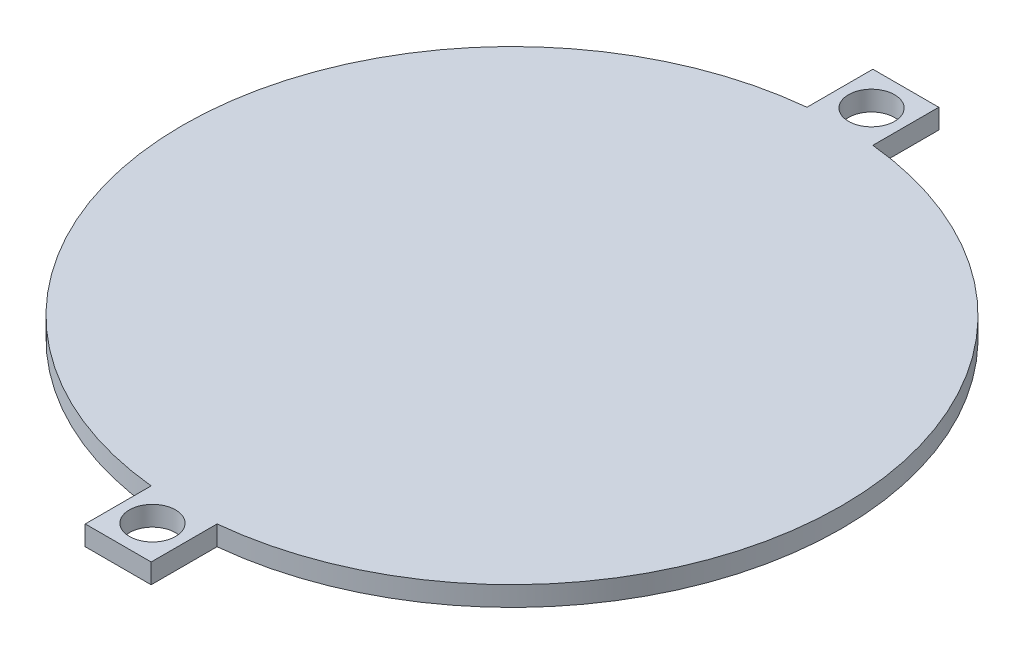
ISO-10303-21;
HEADER;
FILE_DESCRIPTION(('STEP AP214'),'2;1');
FILE_NAME('part.step','',(''),(''),'','','');
FILE_SCHEMA(('AUTOMOTIVE_DESIGN { 1 0 10303 214 1 1 1 1 }'));
ENDSEC;
DATA;
#1=APPLICATION_CONTEXT('core data for automotive mechanical design processes');
#2=APPLICATION_PROTOCOL_DEFINITION('international standard','automotive_design',2000,#1);
#3=PRODUCT_CONTEXT('',#1,'mechanical');
#4=PRODUCT('Part','Part','',(#3));
#5=PRODUCT_RELATED_PRODUCT_CATEGORY('part','',(#4));
#6=PRODUCT_DEFINITION_FORMATION('','',#4);
#7=PRODUCT_DEFINITION_CONTEXT('part definition',#1,'design');
#8=PRODUCT_DEFINITION('design','',#6,#7);
#9=PRODUCT_DEFINITION_SHAPE('','',#8);
#10=(LENGTH_UNIT() NAMED_UNIT(*) SI_UNIT(.MILLI.,.METRE.));
#11=(NAMED_UNIT(*) PLANE_ANGLE_UNIT() SI_UNIT($,.RADIAN.));
#12=(NAMED_UNIT(*) SI_UNIT($,.STERADIAN.) SOLID_ANGLE_UNIT());
#13=UNCERTAINTY_MEASURE_WITH_UNIT(LENGTH_MEASURE(1.E-05),#10,'distance_accuracy_value','');
#14=(GEOMETRIC_REPRESENTATION_CONTEXT(3) GLOBAL_UNCERTAINTY_ASSIGNED_CONTEXT((#13)) GLOBAL_UNIT_ASSIGNED_CONTEXT((#10,
#11,#12)) REPRESENTATION_CONTEXT('',''));
#15=CARTESIAN_POINT('',(0.,0.,0.));
#16=DIRECTION('',(0.,0.,1.));
#17=DIRECTION('',(1.,0.,0.));
#18=AXIS2_PLACEMENT_3D('',#15,#16,#17);
#19=CARTESIAN_POINT('',(0.,12.,0.));
#20=DIRECTION('',(0.,-1.,0.));
#21=DIRECTION('',(0.,0.,-1.));
#22=AXIS2_PLACEMENT_3D('',#19,#20,#21);
#23=CYLINDRICAL_SURFACE('',#22,50.);
#24=CARTESIAN_POINT('',(0.,3.,0.));
#25=DIRECTION('',(0.,1.,0.));
#26=DIRECTION('',(0.,0.,1.));
#27=AXIS2_PLACEMENT_3D('',#24,#25,#26);
#28=CIRCLE('',#27,50.);
#29=CARTESIAN_POINT('',(5.,3.,49.749371855331));
#30=VERTEX_POINT('',#29);
#31=CARTESIAN_POINT('',(5.,3.,-49.749371855331));
#32=VERTEX_POINT('',#31);
#33=EDGE_CURVE('E101',#30,#32,#28,.T.);
#34=ORIENTED_EDGE('',*,*,#33,.F.);
#35=DIRECTION('',(0.,-1.,0.));
#36=VECTOR('',#35,1.);
#37=CARTESIAN_POINT('',(5.,3.,49.749371855331));
#38=LINE('',#37,#36);
#39=CARTESIAN_POINT('',(5.,0.,49.749371855331));
#40=VERTEX_POINT('',#39);
#41=EDGE_CURVE('E103',#30,#40,#38,.T.);
#42=ORIENTED_EDGE('',*,*,#41,.T.);
#43=CARTESIAN_POINT('',(0.,0.,0.));
#44=DIRECTION('',(0.,1.,0.));
#45=DIRECTION('',(0.,0.,1.));
#46=AXIS2_PLACEMENT_3D('',#43,#44,#45);
#47=CIRCLE('',#46,50.);
#48=CARTESIAN_POINT('',(5.,0.,-49.749371855331));
#49=VERTEX_POINT('',#48);
#50=EDGE_CURVE('E44',#40,#49,#47,.T.);
#51=ORIENTED_EDGE('',*,*,#50,.T.);
#52=DIRECTION('',(0.,-1.,0.));
#53=VECTOR('',#52,1.);
#54=CARTESIAN_POINT('',(5.,3.,-49.749371855331));
#55=LINE('',#54,#53);
#56=EDGE_CURVE('E106',#32,#49,#55,.T.);
#57=ORIENTED_EDGE('',*,*,#56,.F.);
#58=EDGE_LOOP('',(#34,#42,#51,#57));
#59=FACE_BOUND('',#58,.T.);
#60=ADVANCED_FACE('F36',(#59),#23,.T.);
#61=CARTESIAN_POINT('',(-5.,3.,-49.749371855331));
#62=VERTEX_POINT('',#61);
#63=CARTESIAN_POINT('',(-5.,3.,49.749371855331));
#64=VERTEX_POINT('',#63);
#65=EDGE_CURVE('E52',#62,#64,#28,.T.);
#66=ORIENTED_EDGE('',*,*,#65,.F.);
#67=DIRECTION('',(0.,-1.,0.));
#68=VECTOR('',#67,1.);
#69=CARTESIAN_POINT('',(-5.,3.,-49.749371855331));
#70=LINE('',#69,#68);
#71=CARTESIAN_POINT('',(-5.,0.,-49.749371855331));
#72=VERTEX_POINT('',#71);
#73=EDGE_CURVE('E164',#62,#72,#70,.T.);
#74=ORIENTED_EDGE('',*,*,#73,.T.);
#75=CARTESIAN_POINT('',(-5.,0.,49.749371855331));
#76=VERTEX_POINT('',#75);
#77=EDGE_CURVE('E11',#72,#76,#47,.T.);
#78=ORIENTED_EDGE('',*,*,#77,.T.);
#79=DIRECTION('',(0.,-1.,0.));
#80=VECTOR('',#79,1.);
#81=CARTESIAN_POINT('',(-5.,3.,49.749371855331));
#82=LINE('',#81,#80);
#83=EDGE_CURVE('E117',#64,#76,#82,.T.);
#84=ORIENTED_EDGE('',*,*,#83,.F.);
#85=EDGE_LOOP('',(#66,#74,#78,#84));
#86=FACE_BOUND('',#85,.T.);
#87=ADVANCED_FACE('F187',(#86),#23,.T.);
#88=CARTESIAN_POINT('',(0.,0.,0.));
#89=DIRECTION('',(0.,1.,0.));
#90=DIRECTION('',(0.,0.,1.));
#91=AXIS2_PLACEMENT_3D('',#88,#89,#90);
#92=PLANE('',#91);
#93=CARTESIAN_POINT('',(0.,0.,-54.549371855331));
#94=DIRECTION('',(0.,-1.,0.));
#95=DIRECTION('',(0.,0.,-1.));
#96=AXIS2_PLACEMENT_3D('',#93,#94,#95);
#97=CIRCLE('',#96,3.5);
#98=CARTESIAN_POINT('',(0.,0.,-58.049371855331));
#99=VERTEX_POINT('',#98);
#100=EDGE_CURVE('E174',#99,#99,#97,.T.);
#101=ORIENTED_EDGE('',*,*,#100,.F.);
#102=EDGE_LOOP('',(#101));
#103=FACE_BOUND('',#102,.T.);
#104=CARTESIAN_POINT('',(0.,0.,54.549371855331));
#105=DIRECTION('',(0.,-1.,0.));
#106=DIRECTION('',(0.,0.,-1.));
#107=AXIS2_PLACEMENT_3D('',#104,#105,#106);
#108=CIRCLE('',#107,3.5);
#109=CARTESIAN_POINT('',(0.,0.,51.049371855331));
#110=VERTEX_POINT('',#109);
#111=EDGE_CURVE('E132',#110,#110,#108,.T.);
#112=ORIENTED_EDGE('',*,*,#111,.F.);
#113=EDGE_LOOP('',(#112));
#114=FACE_BOUND('',#113,.T.);
#115=ORIENTED_EDGE('',*,*,#50,.F.);
#116=DIRECTION('',(0.,0.,1.));
#117=VECTOR('',#116,1.);
#118=CARTESIAN_POINT('',(5.,0.,59.749371855331));
#119=LINE('',#118,#117);
#120=CARTESIAN_POINT('',(5.,0.,59.749371855331));
#121=VERTEX_POINT('',#120);
#122=EDGE_CURVE('E115',#40,#121,#119,.T.);
#123=ORIENTED_EDGE('',*,*,#122,.T.);
#124=DIRECTION('',(-1.,0.,0.));
#125=VECTOR('',#124,1.);
#126=CARTESIAN_POINT('',(5.,0.,59.749371855331));
#127=LINE('',#126,#125);
#128=CARTESIAN_POINT('',(-5.,0.,59.749371855331));
#129=VERTEX_POINT('',#128);
#130=EDGE_CURVE('E129',#121,#129,#127,.T.);
#131=ORIENTED_EDGE('',*,*,#130,.T.);
#132=DIRECTION('',(0.,0.,-1.));
#133=VECTOR('',#132,1.);
#134=CARTESIAN_POINT('',(-5.,0.,59.749371855331));
#135=LINE('',#134,#133);
#136=EDGE_CURVE('E124',#129,#76,#135,.T.);
#137=ORIENTED_EDGE('',*,*,#136,.T.);
#138=ORIENTED_EDGE('',*,*,#77,.F.);
#139=DIRECTION('',(0.,0.,-1.));
#140=VECTOR('',#139,1.);
#141=CARTESIAN_POINT('',(-5.,0.,-49.749371855331));
#142=LINE('',#141,#140);
#143=CARTESIAN_POINT('',(-5.,0.,-59.749371855331));
#144=VERTEX_POINT('',#143);
#145=EDGE_CURVE('E157',#72,#144,#142,.T.);
#146=ORIENTED_EDGE('',*,*,#145,.T.);
#147=DIRECTION('',(-1.,0.,0.));
#148=VECTOR('',#147,1.);
#149=CARTESIAN_POINT('',(5.,0.,-59.749371855331));
#150=LINE('',#149,#148);
#151=CARTESIAN_POINT('',(5.,0.,-59.749371855331));
#152=VERTEX_POINT('',#151);
#153=EDGE_CURVE('E116',#152,#144,#150,.T.);
#154=ORIENTED_EDGE('',*,*,#153,.F.);
#155=DIRECTION('',(0.,0.,-1.));
#156=VECTOR('',#155,1.);
#157=CARTESIAN_POINT('',(5.,0.,-49.749371855331));
#158=LINE('',#157,#156);
#159=EDGE_CURVE('E149',#49,#152,#158,.T.);
#160=ORIENTED_EDGE('',*,*,#159,.F.);
#161=EDGE_LOOP('',(#115,#123,#131,#137,#138,#146,#154,#160));
#162=FACE_BOUND('',#161,.T.);
#163=ADVANCED_FACE('F183',(#103,#114,#162),#92,.F.);
#164=CARTESIAN_POINT('',(5.,3.,-59.749371855331));
#165=DIRECTION('',(0.,0.,1.));
#166=DIRECTION('',(1.,0.,0.));
#167=AXIS2_PLACEMENT_3D('',#164,#165,#166);
#168=PLANE('',#167);
#169=ORIENTED_EDGE('',*,*,#153,.T.);
#170=DIRECTION('',(0.,-1.,0.));
#171=VECTOR('',#170,1.);
#172=CARTESIAN_POINT('',(-5.,3.,-59.749371855331));
#173=LINE('',#172,#171);
#174=CARTESIAN_POINT('',(-5.,3.,-59.749371855331));
#175=VERTEX_POINT('',#174);
#176=EDGE_CURVE('E166',#175,#144,#173,.T.);
#177=ORIENTED_EDGE('',*,*,#176,.F.);
#178=DIRECTION('',(-1.,0.,0.));
#179=VECTOR('',#178,1.);
#180=CARTESIAN_POINT('',(5.,3.,-59.749371855331));
#181=LINE('',#180,#179);
#182=CARTESIAN_POINT('',(5.,3.,-59.749371855331));
#183=VERTEX_POINT('',#182);
#184=EDGE_CURVE('E146',#183,#175,#181,.T.);
#185=ORIENTED_EDGE('',*,*,#184,.F.);
#186=DIRECTION('',(0.,-1.,0.));
#187=VECTOR('',#186,1.);
#188=CARTESIAN_POINT('',(5.,3.,-59.749371855331));
#189=LINE('',#188,#187);
#190=EDGE_CURVE('E154',#183,#152,#189,.T.);
#191=ORIENTED_EDGE('',*,*,#190,.T.);
#192=EDGE_LOOP('',(#169,#177,#185,#191));
#193=FACE_BOUND('',#192,.T.);
#194=ADVANCED_FACE('F186',(#193),#168,.F.);
#195=CARTESIAN_POINT('',(-5.,3.,-49.749371855331));
#196=DIRECTION('',(-1.,0.,0.));
#197=DIRECTION('',(0.,0.,1.));
#198=AXIS2_PLACEMENT_3D('',#195,#196,#197);
#199=PLANE('',#198);
#200=ORIENTED_EDGE('',*,*,#145,.F.);
#201=ORIENTED_EDGE('',*,*,#73,.F.);
#202=DIRECTION('',(0.,0.,-1.));
#203=VECTOR('',#202,1.);
#204=CARTESIAN_POINT('',(-5.,3.,-49.749371855331));
#205=LINE('',#204,#203);
#206=EDGE_CURVE('E148',#62,#175,#205,.T.);
#207=ORIENTED_EDGE('',*,*,#206,.T.);
#208=ORIENTED_EDGE('',*,*,#176,.T.);
#209=EDGE_LOOP('',(#200,#201,#207,#208));
#210=FACE_BOUND('',#209,.T.);
#211=ADVANCED_FACE('F200',(#210),#199,.T.);
#212=CARTESIAN_POINT('',(5.,3.,-49.749371855331));
#213=DIRECTION('',(-1.,0.,0.));
#214=DIRECTION('',(0.,0.,1.));
#215=AXIS2_PLACEMENT_3D('',#212,#213,#214);
#216=PLANE('',#215);
#217=ORIENTED_EDGE('',*,*,#159,.T.);
#218=ORIENTED_EDGE('',*,*,#190,.F.);
#219=DIRECTION('',(0.,0.,-1.));
#220=VECTOR('',#219,1.);
#221=CARTESIAN_POINT('',(5.,3.,-49.749371855331));
#222=LINE('',#221,#220);
#223=EDGE_CURVE('E152',#32,#183,#222,.T.);
#224=ORIENTED_EDGE('',*,*,#223,.F.);
#225=ORIENTED_EDGE('',*,*,#56,.T.);
#226=EDGE_LOOP('',(#217,#218,#224,#225));
#227=FACE_BOUND('',#226,.T.);
#228=ADVANCED_FACE('F192',(#227),#216,.F.);
#229=CARTESIAN_POINT('',(0.,3.,0.));
#230=DIRECTION('',(0.,-1.,0.));
#231=DIRECTION('',(0.,0.,-1.));
#232=AXIS2_PLACEMENT_3D('',#229,#230,#231);
#233=PLANE('',#232);
#234=CARTESIAN_POINT('',(0.,3.,-54.549371855331));
#235=DIRECTION('',(0.,-1.,0.));
#236=DIRECTION('',(0.,0.,-1.));
#237=AXIS2_PLACEMENT_3D('',#234,#235,#236);
#238=CIRCLE('',#237,3.5);
#239=CARTESIAN_POINT('',(0.,3.,-58.049371855331));
#240=VERTEX_POINT('',#239);
#241=EDGE_CURVE('E39',#240,#240,#238,.T.);
#242=ORIENTED_EDGE('',*,*,#241,.T.);
#243=EDGE_LOOP('',(#242));
#244=FACE_BOUND('',#243,.T.);
#245=ORIENTED_EDGE('',*,*,#206,.F.);
#246=ORIENTED_EDGE('',*,*,#65,.T.);
#247=DIRECTION('',(0.,0.,-1.));
#248=VECTOR('',#247,1.);
#249=CARTESIAN_POINT('',(-5.,3.,59.749371855331));
#250=LINE('',#249,#248);
#251=CARTESIAN_POINT('',(-5.,3.,59.749371855331));
#252=VERTEX_POINT('',#251);
#253=EDGE_CURVE('E126',#252,#64,#250,.T.);
#254=ORIENTED_EDGE('',*,*,#253,.F.);
#255=DIRECTION('',(-1.,0.,0.));
#256=VECTOR('',#255,1.);
#257=CARTESIAN_POINT('',(5.,3.,59.749371855331));
#258=LINE('',#257,#256);
#259=CARTESIAN_POINT('',(5.,3.,59.749371855331));
#260=VERTEX_POINT('',#259);
#261=EDGE_CURVE('E123',#260,#252,#258,.T.);
#262=ORIENTED_EDGE('',*,*,#261,.F.);
#263=DIRECTION('',(0.,0.,1.));
#264=VECTOR('',#263,1.);
#265=CARTESIAN_POINT('',(5.,3.,59.749371855331));
#266=LINE('',#265,#264);
#267=EDGE_CURVE('E113',#30,#260,#266,.T.);
#268=ORIENTED_EDGE('',*,*,#267,.F.);
#269=ORIENTED_EDGE('',*,*,#33,.T.);
#270=ORIENTED_EDGE('',*,*,#223,.T.);
#271=ORIENTED_EDGE('',*,*,#184,.T.);
#272=EDGE_LOOP('',(#245,#246,#254,#262,#268,#269,#270,#271));
#273=FACE_BOUND('',#272,.T.);
#274=CARTESIAN_POINT('',(0.,3.,54.549371855331));
#275=DIRECTION('',(0.,1.,0.));
#276=DIRECTION('',(0.,0.,1.));
#277=AXIS2_PLACEMENT_3D('',#274,#275,#276);
#278=CIRCLE('',#277,3.5);
#279=CARTESIAN_POINT('',(0.,3.,58.049371855331));
#280=VERTEX_POINT('',#279);
#281=EDGE_CURVE('E139',#280,#280,#278,.T.);
#282=ORIENTED_EDGE('',*,*,#281,.F.);
#283=EDGE_LOOP('',(#282));
#284=FACE_BOUND('',#283,.T.);
#285=ADVANCED_FACE('F120',(#244,#273,#284),#233,.F.);
#286=CARTESIAN_POINT('',(5.,3.,59.749371855331));
#287=DIRECTION('',(1.,0.,0.));
#288=DIRECTION('',(0.,0.,-1.));
#289=AXIS2_PLACEMENT_3D('',#286,#287,#288);
#290=PLANE('',#289);
#291=ORIENTED_EDGE('',*,*,#122,.F.);
#292=ORIENTED_EDGE('',*,*,#41,.F.);
#293=ORIENTED_EDGE('',*,*,#267,.T.);
#294=DIRECTION('',(0.,-1.,0.));
#295=VECTOR('',#294,1.);
#296=CARTESIAN_POINT('',(5.,3.,59.749371855331));
#297=LINE('',#296,#295);
#298=EDGE_CURVE('E137',#260,#121,#297,.T.);
#299=ORIENTED_EDGE('',*,*,#298,.T.);
#300=EDGE_LOOP('',(#291,#292,#293,#299));
#301=FACE_BOUND('',#300,.T.);
#302=ADVANCED_FACE('F112',(#301),#290,.T.);
#303=CARTESIAN_POINT('',(-5.,3.,59.749371855331));
#304=DIRECTION('',(-1.,0.,0.));
#305=DIRECTION('',(0.,0.,1.));
#306=AXIS2_PLACEMENT_3D('',#303,#304,#305);
#307=PLANE('',#306);
#308=ORIENTED_EDGE('',*,*,#136,.F.);
#309=DIRECTION('',(0.,-1.,0.));
#310=VECTOR('',#309,1.);
#311=CARTESIAN_POINT('',(-5.,3.,59.749371855331));
#312=LINE('',#311,#310);
#313=EDGE_CURVE('E143',#252,#129,#312,.T.);
#314=ORIENTED_EDGE('',*,*,#313,.F.);
#315=ORIENTED_EDGE('',*,*,#253,.T.);
#316=ORIENTED_EDGE('',*,*,#83,.T.);
#317=EDGE_LOOP('',(#308,#314,#315,#316));
#318=FACE_BOUND('',#317,.T.);
#319=ADVANCED_FACE('F203',(#318),#307,.T.);
#320=CARTESIAN_POINT('',(5.,3.,59.749371855331));
#321=DIRECTION('',(0.,0.,1.));
#322=DIRECTION('',(1.,0.,0.));
#323=AXIS2_PLACEMENT_3D('',#320,#321,#322);
#324=PLANE('',#323);
#325=ORIENTED_EDGE('',*,*,#130,.F.);
#326=ORIENTED_EDGE('',*,*,#298,.F.);
#327=ORIENTED_EDGE('',*,*,#261,.T.);
#328=ORIENTED_EDGE('',*,*,#313,.T.);
#329=EDGE_LOOP('',(#325,#326,#327,#328));
#330=FACE_BOUND('',#329,.T.);
#331=ADVANCED_FACE('F206',(#330),#324,.T.);
#332=CARTESIAN_POINT('',(0.,10.,54.549371855331));
#333=DIRECTION('',(0.,-1.,0.));
#334=DIRECTION('',(0.,0.,-1.));
#335=AXIS2_PLACEMENT_3D('',#332,#333,#334);
#336=CYLINDRICAL_SURFACE('',#335,3.5);
#337=ORIENTED_EDGE('',*,*,#281,.T.);
#338=EDGE_LOOP('',(#337));
#339=FACE_BOUND('',#338,.T.);
#340=ORIENTED_EDGE('',*,*,#111,.T.);
#341=EDGE_LOOP('',(#340));
#342=FACE_BOUND('',#341,.T.);
#343=ADVANCED_FACE('F208',(#339,#342),#336,.F.);
#344=CARTESIAN_POINT('',(0.,10.,-54.549371855331));
#345=DIRECTION('',(0.,-1.,0.));
#346=DIRECTION('',(0.,0.,-1.));
#347=AXIS2_PLACEMENT_3D('',#344,#345,#346);
#348=CYLINDRICAL_SURFACE('',#347,3.5);
#349=ORIENTED_EDGE('',*,*,#100,.T.);
#350=EDGE_LOOP('',(#349));
#351=FACE_BOUND('',#350,.T.);
#352=ORIENTED_EDGE('',*,*,#241,.F.);
#353=EDGE_LOOP('',(#352));
#354=FACE_BOUND('',#353,.T.);
#355=ADVANCED_FACE('F180',(#351,#354),#348,.F.);
#356=CLOSED_SHELL('',(#60,#87,#163,#194,#211,#228,#285,#302,#319,#331,#343,#355));
#357=MANIFOLD_SOLID_BREP('B2',#356);
#358=ADVANCED_BREP_SHAPE_REPRESENTATION('',(#18,#357),#14);
#359=SHAPE_DEFINITION_REPRESENTATION(#9,#358);
ENDSEC;
END-ISO-10303-21;
